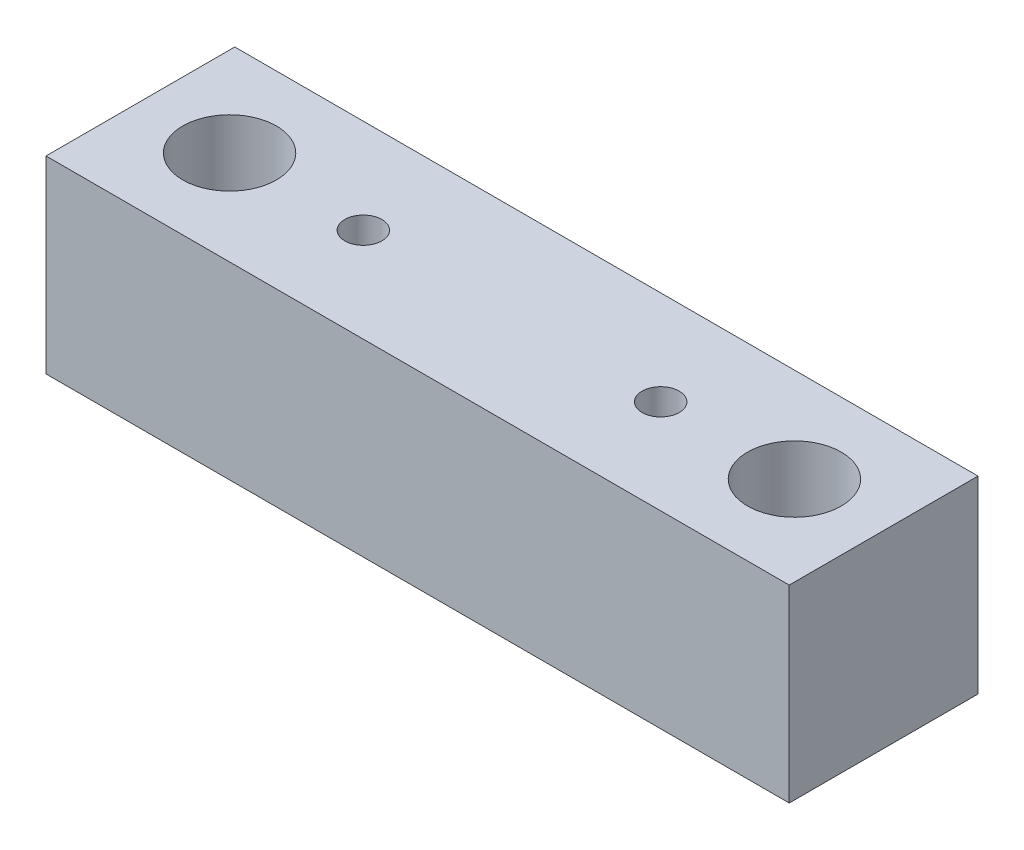
ISO-10303-21;
HEADER;
FILE_DESCRIPTION(('STEP AP214'),'2;1');
FILE_NAME('part.step','',(''),(''),'','','');
FILE_SCHEMA(('AUTOMOTIVE_DESIGN { 1 0 10303 214 1 1 1 1 }'));
ENDSEC;
DATA;
#1=APPLICATION_CONTEXT('core data for automotive mechanical design processes');
#2=APPLICATION_PROTOCOL_DEFINITION('international standard','automotive_design',2000,#1);
#3=PRODUCT_CONTEXT('',#1,'mechanical');
#4=PRODUCT('Part','Part','',(#3));
#5=PRODUCT_RELATED_PRODUCT_CATEGORY('part','',(#4));
#6=PRODUCT_DEFINITION_FORMATION('','',#4);
#7=PRODUCT_DEFINITION_CONTEXT('part definition',#1,'design');
#8=PRODUCT_DEFINITION('design','',#6,#7);
#9=PRODUCT_DEFINITION_SHAPE('','',#8);
#10=(LENGTH_UNIT() NAMED_UNIT(*) SI_UNIT(.MILLI.,.METRE.));
#11=(NAMED_UNIT(*) PLANE_ANGLE_UNIT() SI_UNIT($,.RADIAN.));
#12=(NAMED_UNIT(*) SI_UNIT($,.STERADIAN.) SOLID_ANGLE_UNIT());
#13=UNCERTAINTY_MEASURE_WITH_UNIT(LENGTH_MEASURE(1.E-05),#10,'distance_accuracy_value','');
#14=(GEOMETRIC_REPRESENTATION_CONTEXT(3) GLOBAL_UNCERTAINTY_ASSIGNED_CONTEXT((#13)) GLOBAL_UNIT_ASSIGNED_CONTEXT((#10,
#11,#12)) REPRESENTATION_CONTEXT('',''));
#15=CARTESIAN_POINT('',(0.,0.,0.));
#16=DIRECTION('',(0.,0.,1.));
#17=DIRECTION('',(1.,0.,0.));
#18=AXIS2_PLACEMENT_3D('',#15,#16,#17);
#19=CARTESIAN_POINT('',(0.,12.7,0.));
#20=DIRECTION('',(0.,-1.,0.));
#21=DIRECTION('',(0.,0.,-1.));
#22=AXIS2_PLACEMENT_3D('',#19,#20,#21);
#23=PLANE('',#22);
#24=DIRECTION('',(0.,0.,1.));
#25=VECTOR('',#24,1.);
#26=CARTESIAN_POINT('',(0.,12.7,0.));
#27=LINE('',#26,#25);
#28=CARTESIAN_POINT('',(0.,12.7,-12.7));
#29=VERTEX_POINT('',#28);
#30=CARTESIAN_POINT('',(0.,12.7,0.));
#31=VERTEX_POINT('',#30);
#32=EDGE_CURVE('E89',#29,#31,#27,.T.);
#33=ORIENTED_EDGE('',*,*,#32,.T.);
#34=DIRECTION('',(1.,0.,0.));
#35=VECTOR('',#34,1.);
#36=CARTESIAN_POINT('',(0.,12.7,0.));
#37=LINE('',#36,#35);
#38=CARTESIAN_POINT('',(50.,12.7,0.));
#39=VERTEX_POINT('',#38);
#40=EDGE_CURVE('E84',#31,#39,#37,.T.);
#41=ORIENTED_EDGE('',*,*,#40,.T.);
#42=DIRECTION('',(0.,0.,-1.));
#43=VECTOR('',#42,1.);
#44=CARTESIAN_POINT('',(50.,12.7,0.));
#45=LINE('',#44,#43);
#46=CARTESIAN_POINT('',(50.,12.7,-12.7));
#47=VERTEX_POINT('',#46);
#48=EDGE_CURVE('E87',#39,#47,#45,.T.);
#49=ORIENTED_EDGE('',*,*,#48,.T.);
#50=DIRECTION('',(-1.,0.,0.));
#51=VECTOR('',#50,1.);
#52=CARTESIAN_POINT('',(0.,12.7,-12.7));
#53=LINE('',#52,#51);
#54=EDGE_CURVE('E54',#47,#29,#53,.T.);
#55=ORIENTED_EDGE('',*,*,#54,.T.);
#56=EDGE_LOOP('',(#33,#41,#49,#55));
#57=FACE_BOUND('',#56,.T.);
#58=CARTESIAN_POINT('',(6.,12.7,-6.35));
#59=DIRECTION('',(0.,1.,0.));
#60=DIRECTION('',(0.,0.,1.));
#61=AXIS2_PLACEMENT_3D('',#58,#59,#60);
#62=CIRCLE('',#61,3.15);
#63=CARTESIAN_POINT('',(6.,12.7,-3.2));
#64=VERTEX_POINT('',#63);
#65=EDGE_CURVE('E104',#64,#64,#62,.T.);
#66=ORIENTED_EDGE('',*,*,#65,.F.);
#67=EDGE_LOOP('',(#66));
#68=FACE_BOUND('',#67,.T.);
#69=CARTESIAN_POINT('',(15.,12.7,-6.35));
#70=DIRECTION('',(0.,1.,0.));
#71=DIRECTION('',(0.,0.,1.));
#72=AXIS2_PLACEMENT_3D('',#69,#70,#71);
#73=CIRCLE('',#72,1.25);
#74=CARTESIAN_POINT('',(15.,12.7,-5.1));
#75=VERTEX_POINT('',#74);
#76=EDGE_CURVE('E119',#75,#75,#73,.T.);
#77=ORIENTED_EDGE('',*,*,#76,.F.);
#78=EDGE_LOOP('',(#77));
#79=FACE_BOUND('',#78,.T.);
#80=CARTESIAN_POINT('',(35.,12.7,-6.35));
#81=DIRECTION('',(0.,1.,0.));
#82=DIRECTION('',(0.,0.,-1.));
#83=AXIS2_PLACEMENT_3D('',#80,#81,#82);
#84=CIRCLE('',#83,1.25);
#85=CARTESIAN_POINT('',(35.,12.7,-7.6));
#86=VERTEX_POINT('',#85);
#87=EDGE_CURVE('E125',#86,#86,#84,.T.);
#88=ORIENTED_EDGE('',*,*,#87,.F.);
#89=EDGE_LOOP('',(#88));
#90=FACE_BOUND('',#89,.T.);
#91=CARTESIAN_POINT('',(44.,12.7,-6.35));
#92=DIRECTION('',(0.,1.,0.));
#93=DIRECTION('',(0.,0.,-1.));
#94=AXIS2_PLACEMENT_3D('',#91,#92,#93);
#95=CIRCLE('',#94,3.14999999999999);
#96=CARTESIAN_POINT('',(44.,12.7,-9.5));
#97=VERTEX_POINT('',#96);
#98=EDGE_CURVE('E131',#97,#97,#95,.T.);
#99=ORIENTED_EDGE('',*,*,#98,.F.);
#100=EDGE_LOOP('',(#99));
#101=FACE_BOUND('',#100,.T.);
#102=ADVANCED_FACE('F37',(#57,#68,#79,#90,#101),#23,.F.);
#103=CARTESIAN_POINT('',(0.,0.,0.));
#104=DIRECTION('',(0.,-1.,0.));
#105=DIRECTION('',(0.,0.,-1.));
#106=AXIS2_PLACEMENT_3D('',#103,#104,#105);
#107=PLANE('',#106);
#108=CARTESIAN_POINT('',(35.,0.,-6.35));
#109=DIRECTION('',(0.,1.,0.));
#110=DIRECTION('',(0.,0.,-1.));
#111=AXIS2_PLACEMENT_3D('',#108,#109,#110);
#112=CIRCLE('',#111,1.25);
#113=CARTESIAN_POINT('',(35.,0.,-7.6));
#114=VERTEX_POINT('',#113);
#115=EDGE_CURVE('E128',#114,#114,#112,.T.);
#116=ORIENTED_EDGE('',*,*,#115,.T.);
#117=EDGE_LOOP('',(#116));
#118=FACE_BOUND('',#117,.T.);
#119=CARTESIAN_POINT('',(6.,0.,-6.35));
#120=DIRECTION('',(0.,1.,0.));
#121=DIRECTION('',(0.,0.,1.));
#122=AXIS2_PLACEMENT_3D('',#119,#120,#121);
#123=CIRCLE('',#122,3.15);
#124=CARTESIAN_POINT('',(6.,0.,-3.2));
#125=VERTEX_POINT('',#124);
#126=EDGE_CURVE('E116',#125,#125,#123,.T.);
#127=ORIENTED_EDGE('',*,*,#126,.T.);
#128=EDGE_LOOP('',(#127));
#129=FACE_BOUND('',#128,.T.);
#130=DIRECTION('',(0.,0.,1.));
#131=VECTOR('',#130,1.);
#132=CARTESIAN_POINT('',(0.,0.,0.));
#133=LINE('',#132,#131);
#134=CARTESIAN_POINT('',(0.,0.,-12.7));
#135=VERTEX_POINT('',#134);
#136=CARTESIAN_POINT('',(0.,0.,0.));
#137=VERTEX_POINT('',#136);
#138=EDGE_CURVE('E101',#135,#137,#133,.T.);
#139=ORIENTED_EDGE('',*,*,#138,.F.);
#140=DIRECTION('',(-1.,0.,0.));
#141=VECTOR('',#140,1.);
#142=CARTESIAN_POINT('',(0.,0.,-12.7));
#143=LINE('',#142,#141);
#144=CARTESIAN_POINT('',(50.,0.,-12.7));
#145=VERTEX_POINT('',#144);
#146=EDGE_CURVE('E77',#145,#135,#143,.T.);
#147=ORIENTED_EDGE('',*,*,#146,.F.);
#148=DIRECTION('',(0.,0.,-1.));
#149=VECTOR('',#148,1.);
#150=CARTESIAN_POINT('',(50.,0.,0.));
#151=LINE('',#150,#149);
#152=CARTESIAN_POINT('',(50.,0.,0.));
#153=VERTEX_POINT('',#152);
#154=EDGE_CURVE('E71',#153,#145,#151,.T.);
#155=ORIENTED_EDGE('',*,*,#154,.F.);
#156=DIRECTION('',(1.,0.,0.));
#157=VECTOR('',#156,1.);
#158=CARTESIAN_POINT('',(0.,0.,0.));
#159=LINE('',#158,#157);
#160=EDGE_CURVE('E93',#137,#153,#159,.T.);
#161=ORIENTED_EDGE('',*,*,#160,.F.);
#162=EDGE_LOOP('',(#139,#147,#155,#161));
#163=FACE_BOUND('',#162,.T.);
#164=CARTESIAN_POINT('',(15.,0.,-6.35));
#165=DIRECTION('',(0.,1.,0.));
#166=DIRECTION('',(0.,0.,1.));
#167=AXIS2_PLACEMENT_3D('',#164,#165,#166);
#168=CIRCLE('',#167,1.25);
#169=CARTESIAN_POINT('',(15.,0.,-5.1));
#170=VERTEX_POINT('',#169);
#171=EDGE_CURVE('E122',#170,#170,#168,.T.);
#172=ORIENTED_EDGE('',*,*,#171,.T.);
#173=EDGE_LOOP('',(#172));
#174=FACE_BOUND('',#173,.T.);
#175=CARTESIAN_POINT('',(44.,0.,-6.35));
#176=DIRECTION('',(0.,1.,0.));
#177=DIRECTION('',(0.,0.,-1.));
#178=AXIS2_PLACEMENT_3D('',#175,#176,#177);
#179=CIRCLE('',#178,3.14999999999999);
#180=CARTESIAN_POINT('',(44.,0.,-9.5));
#181=VERTEX_POINT('',#180);
#182=EDGE_CURVE('E134',#181,#181,#179,.T.);
#183=ORIENTED_EDGE('',*,*,#182,.T.);
#184=EDGE_LOOP('',(#183));
#185=FACE_BOUND('',#184,.T.);
#186=ADVANCED_FACE('F112',(#118,#129,#163,#174,#185),#107,.T.);
#187=CARTESIAN_POINT('',(0.,12.7,0.));
#188=DIRECTION('',(1.,0.,0.));
#189=DIRECTION('',(0.,0.,-1.));
#190=AXIS2_PLACEMENT_3D('',#187,#188,#189);
#191=PLANE('',#190);
#192=ORIENTED_EDGE('',*,*,#138,.T.);
#193=DIRECTION('',(0.,-1.,0.));
#194=VECTOR('',#193,1.);
#195=CARTESIAN_POINT('',(0.,12.7,0.));
#196=LINE('',#195,#194);
#197=EDGE_CURVE('E11',#31,#137,#196,.T.);
#198=ORIENTED_EDGE('',*,*,#197,.F.);
#199=ORIENTED_EDGE('',*,*,#32,.F.);
#200=DIRECTION('',(0.,-1.,0.));
#201=VECTOR('',#200,1.);
#202=CARTESIAN_POINT('',(0.,12.7,-12.7));
#203=LINE('',#202,#201);
#204=EDGE_CURVE('E97',#29,#135,#203,.T.);
#205=ORIENTED_EDGE('',*,*,#204,.T.);
#206=EDGE_LOOP('',(#192,#198,#199,#205));
#207=FACE_BOUND('',#206,.T.);
#208=ADVANCED_FACE('F39',(#207),#191,.F.);
#209=CARTESIAN_POINT('',(0.,12.7,0.));
#210=DIRECTION('',(0.,0.,-1.));
#211=DIRECTION('',(-1.,0.,0.));
#212=AXIS2_PLACEMENT_3D('',#209,#210,#211);
#213=PLANE('',#212);
#214=ORIENTED_EDGE('',*,*,#160,.T.);
#215=DIRECTION('',(0.,-1.,0.));
#216=VECTOR('',#215,1.);
#217=CARTESIAN_POINT('',(50.,12.7,0.));
#218=LINE('',#217,#216);
#219=EDGE_CURVE('E46',#39,#153,#218,.T.);
#220=ORIENTED_EDGE('',*,*,#219,.F.);
#221=ORIENTED_EDGE('',*,*,#40,.F.);
#222=ORIENTED_EDGE('',*,*,#197,.T.);
#223=EDGE_LOOP('',(#214,#220,#221,#222));
#224=FACE_BOUND('',#223,.T.);
#225=ADVANCED_FACE('F92',(#224),#213,.F.);
#226=CARTESIAN_POINT('',(50.,12.7,0.));
#227=DIRECTION('',(-1.,0.,0.));
#228=DIRECTION('',(0.,0.,1.));
#229=AXIS2_PLACEMENT_3D('',#226,#227,#228);
#230=PLANE('',#229);
#231=ORIENTED_EDGE('',*,*,#154,.T.);
#232=DIRECTION('',(0.,-1.,0.));
#233=VECTOR('',#232,1.);
#234=CARTESIAN_POINT('',(50.,12.7,-12.7));
#235=LINE('',#234,#233);
#236=EDGE_CURVE('E94',#47,#145,#235,.T.);
#237=ORIENTED_EDGE('',*,*,#236,.F.);
#238=ORIENTED_EDGE('',*,*,#48,.F.);
#239=ORIENTED_EDGE('',*,*,#219,.T.);
#240=EDGE_LOOP('',(#231,#237,#238,#239));
#241=FACE_BOUND('',#240,.T.);
#242=ADVANCED_FACE('F95',(#241),#230,.F.);
#243=CARTESIAN_POINT('',(0.,12.7,-12.7));
#244=DIRECTION('',(0.,0.,1.));
#245=DIRECTION('',(1.,0.,0.));
#246=AXIS2_PLACEMENT_3D('',#243,#244,#245);
#247=PLANE('',#246);
#248=ORIENTED_EDGE('',*,*,#146,.T.);
#249=ORIENTED_EDGE('',*,*,#204,.F.);
#250=ORIENTED_EDGE('',*,*,#54,.F.);
#251=ORIENTED_EDGE('',*,*,#236,.T.);
#252=EDGE_LOOP('',(#248,#249,#250,#251));
#253=FACE_BOUND('',#252,.T.);
#254=ADVANCED_FACE('F109',(#253),#247,.F.);
#255=CARTESIAN_POINT('',(6.,12.7,-6.35));
#256=DIRECTION('',(0.,-1.,0.));
#257=DIRECTION('',(0.,0.,-1.));
#258=AXIS2_PLACEMENT_3D('',#255,#256,#257);
#259=CYLINDRICAL_SURFACE('',#258,3.15);
#260=ORIENTED_EDGE('',*,*,#65,.T.);
#261=EDGE_LOOP('',(#260));
#262=FACE_BOUND('',#261,.T.);
#263=ORIENTED_EDGE('',*,*,#126,.F.);
#264=EDGE_LOOP('',(#263));
#265=FACE_BOUND('',#264,.T.);
#266=ADVANCED_FACE('F151',(#262,#265),#259,.F.);
#267=CARTESIAN_POINT('',(15.,12.7,-6.35));
#268=DIRECTION('',(0.,-1.,0.));
#269=DIRECTION('',(0.,0.,-1.));
#270=AXIS2_PLACEMENT_3D('',#267,#268,#269);
#271=CYLINDRICAL_SURFACE('',#270,1.25);
#272=ORIENTED_EDGE('',*,*,#76,.T.);
#273=EDGE_LOOP('',(#272));
#274=FACE_BOUND('',#273,.T.);
#275=ORIENTED_EDGE('',*,*,#171,.F.);
#276=EDGE_LOOP('',(#275));
#277=FACE_BOUND('',#276,.T.);
#278=ADVANCED_FACE('F197',(#274,#277),#271,.F.);
#279=CARTESIAN_POINT('',(35.,12.7,-6.35));
#280=DIRECTION('',(0.,-1.,0.));
#281=DIRECTION('',(0.,0.,-1.));
#282=AXIS2_PLACEMENT_3D('',#279,#280,#281);
#283=CYLINDRICAL_SURFACE('',#282,1.25);
#284=ORIENTED_EDGE('',*,*,#87,.T.);
#285=EDGE_LOOP('',(#284));
#286=FACE_BOUND('',#285,.T.);
#287=ORIENTED_EDGE('',*,*,#115,.F.);
#288=EDGE_LOOP('',(#287));
#289=FACE_BOUND('',#288,.T.);
#290=ADVANCED_FACE('F205',(#286,#289),#283,.F.);
#291=CARTESIAN_POINT('',(44.,12.7,-6.35));
#292=DIRECTION('',(0.,-1.,0.));
#293=DIRECTION('',(0.,0.,-1.));
#294=AXIS2_PLACEMENT_3D('',#291,#292,#293);
#295=CYLINDRICAL_SURFACE('',#294,3.14999999999999);
#296=ORIENTED_EDGE('',*,*,#98,.T.);
#297=EDGE_LOOP('',(#296));
#298=FACE_BOUND('',#297,.T.);
#299=ORIENTED_EDGE('',*,*,#182,.F.);
#300=EDGE_LOOP('',(#299));
#301=FACE_BOUND('',#300,.T.);
#302=ADVANCED_FACE('F140',(#298,#301),#295,.F.);
#303=CLOSED_SHELL('',(#102,#186,#208,#225,#242,#254,#266,#278,#290,#302));
#304=MANIFOLD_SOLID_BREP('B2',#303);
#305=ADVANCED_BREP_SHAPE_REPRESENTATION('',(#18,#304),#14);
#306=SHAPE_DEFINITION_REPRESENTATION(#9,#305);
ENDSEC;
END-ISO-10303-21;
